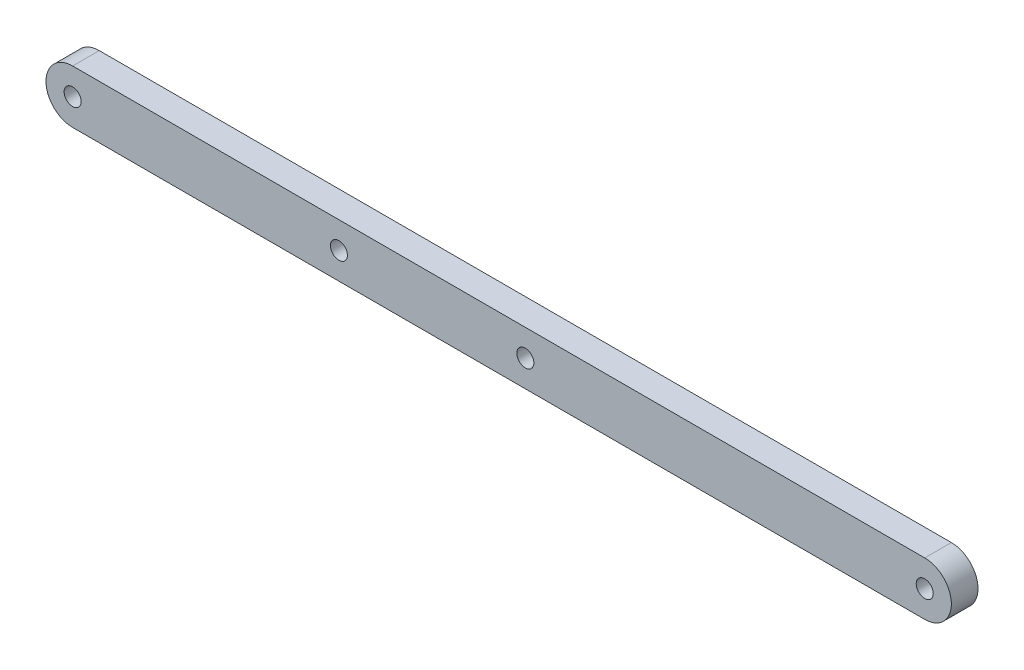
ISO-10303-21;
HEADER;
FILE_DESCRIPTION(('STEP AP214'),'2;1');
FILE_NAME('part.step','',(''),(''),'','','');
FILE_SCHEMA(('AUTOMOTIVE_DESIGN { 1 0 10303 214 1 1 1 1 }'));
ENDSEC;
DATA;
#1=APPLICATION_CONTEXT('core data for automotive mechanical design processes');
#2=APPLICATION_PROTOCOL_DEFINITION('international standard','automotive_design',2000,#1);
#3=PRODUCT_CONTEXT('',#1,'mechanical');
#4=PRODUCT('Part','Part','',(#3));
#5=PRODUCT_RELATED_PRODUCT_CATEGORY('part','',(#4));
#6=PRODUCT_DEFINITION_FORMATION('','',#4);
#7=PRODUCT_DEFINITION_CONTEXT('part definition',#1,'design');
#8=PRODUCT_DEFINITION('design','',#6,#7);
#9=PRODUCT_DEFINITION_SHAPE('','',#8);
#10=(LENGTH_UNIT() NAMED_UNIT(*) SI_UNIT(.MILLI.,.METRE.));
#11=(NAMED_UNIT(*) PLANE_ANGLE_UNIT() SI_UNIT($,.RADIAN.));
#12=(NAMED_UNIT(*) SI_UNIT($,.STERADIAN.) SOLID_ANGLE_UNIT());
#13=UNCERTAINTY_MEASURE_WITH_UNIT(LENGTH_MEASURE(1.E-05),#10,'distance_accuracy_value','');
#14=(GEOMETRIC_REPRESENTATION_CONTEXT(3) GLOBAL_UNCERTAINTY_ASSIGNED_CONTEXT((#13)) GLOBAL_UNIT_ASSIGNED_CONTEXT((#10,
#11,#12)) REPRESENTATION_CONTEXT('',''));
#15=CARTESIAN_POINT('',(0.,0.,0.));
#16=DIRECTION('',(0.,0.,1.));
#17=DIRECTION('',(1.,0.,0.));
#18=AXIS2_PLACEMENT_3D('',#15,#16,#17);
#19=CARTESIAN_POINT('',(0.,0.,-3.175));
#20=DIRECTION('',(0.,0.,-1.));
#21=DIRECTION('',(1.,0.,0.));
#22=AXIS2_PLACEMENT_3D('',#19,#20,#21);
#23=PLANE('',#22);
#24=CARTESIAN_POINT('',(63.5,0.,-3.175));
#25=DIRECTION('',(0.,0.,1.));
#26=DIRECTION('',(1.,0.,0.));
#27=AXIS2_PLACEMENT_3D('',#24,#25,#26);
#28=CIRCLE('',#27,2.03200000000001);
#29=CARTESIAN_POINT('',(65.532,0.,-3.175));
#30=VERTEX_POINT('',#29);
#31=EDGE_CURVE('E135',#30,#30,#28,.T.);
#32=ORIENTED_EDGE('',*,*,#31,.T.);
#33=EDGE_LOOP('',(#32));
#34=FACE_BOUND('',#33,.T.);
#35=CARTESIAN_POINT('',(0.,0.,-3.175));
#36=DIRECTION('',(0.,0.,1.));
#37=DIRECTION('',(1.,0.,0.));
#38=AXIS2_PLACEMENT_3D('',#35,#36,#37);
#39=CIRCLE('',#38,2.032);
#40=CARTESIAN_POINT('',(2.032,0.,-3.175));
#41=VERTEX_POINT('',#40);
#42=EDGE_CURVE('E136',#41,#41,#39,.T.);
#43=ORIENTED_EDGE('',*,*,#42,.T.);
#44=EDGE_LOOP('',(#43));
#45=FACE_BOUND('',#44,.T.);
#46=CARTESIAN_POINT('',(0.,0.,-3.175));
#47=DIRECTION('',(0.,0.,1.));
#48=DIRECTION('',(1.,0.,0.));
#49=AXIS2_PLACEMENT_3D('',#46,#47,#48);
#50=CIRCLE('',#49,6.35);
#51=CARTESIAN_POINT('',(0.,6.35,-3.175));
#52=VERTEX_POINT('',#51);
#53=CARTESIAN_POINT('',(0.,-6.35,-3.175));
#54=VERTEX_POINT('',#53);
#55=EDGE_CURVE('E107',#52,#54,#50,.T.);
#56=ORIENTED_EDGE('',*,*,#55,.F.);
#57=DIRECTION('',(-1.,0.,0.));
#58=VECTOR('',#57,1.);
#59=CARTESIAN_POINT('',(0.,6.35,-3.175));
#60=LINE('',#59,#58);
#61=CARTESIAN_POINT('',(203.2,6.35,-3.175));
#62=VERTEX_POINT('',#61);
#63=EDGE_CURVE('E110',#62,#52,#60,.T.);
#64=ORIENTED_EDGE('',*,*,#63,.F.);
#65=CARTESIAN_POINT('',(203.2,0.,-3.175));
#66=DIRECTION('',(0.,0.,1.));
#67=DIRECTION('',(1.,0.,0.));
#68=AXIS2_PLACEMENT_3D('',#65,#66,#67);
#69=CIRCLE('',#68,6.35);
#70=CARTESIAN_POINT('',(203.2,-6.35,-3.175));
#71=VERTEX_POINT('',#70);
#72=EDGE_CURVE('E97',#71,#62,#69,.T.);
#73=ORIENTED_EDGE('',*,*,#72,.F.);
#74=DIRECTION('',(1.,0.,0.));
#75=VECTOR('',#74,1.);
#76=CARTESIAN_POINT('',(0.,-6.35,-3.175));
#77=LINE('',#76,#75);
#78=EDGE_CURVE('E102',#54,#71,#77,.T.);
#79=ORIENTED_EDGE('',*,*,#78,.F.);
#80=EDGE_LOOP('',(#56,#64,#73,#79));
#81=FACE_BOUND('',#80,.T.);
#82=CARTESIAN_POINT('',(203.2,0.,-3.175));
#83=DIRECTION('',(0.,0.,1.));
#84=DIRECTION('',(1.,0.,0.));
#85=AXIS2_PLACEMENT_3D('',#82,#83,#84);
#86=CIRCLE('',#85,2.03200000000001);
#87=CARTESIAN_POINT('',(205.232,0.,-3.175));
#88=VERTEX_POINT('',#87);
#89=EDGE_CURVE('E124',#88,#88,#86,.T.);
#90=ORIENTED_EDGE('',*,*,#89,.T.);
#91=EDGE_LOOP('',(#90));
#92=FACE_BOUND('',#91,.T.);
#93=CARTESIAN_POINT('',(107.95,0.,-3.175));
#94=DIRECTION('',(0.,0.,1.));
#95=DIRECTION('',(1.,0.,0.));
#96=AXIS2_PLACEMENT_3D('',#93,#94,#95);
#97=CIRCLE('',#96,2.03200000000001);
#98=CARTESIAN_POINT('',(109.982,0.,-3.175));
#99=VERTEX_POINT('',#98);
#100=EDGE_CURVE('E253',#99,#99,#97,.T.);
#101=ORIENTED_EDGE('',*,*,#100,.T.);
#102=EDGE_LOOP('',(#101));
#103=FACE_BOUND('',#102,.T.);
#104=ADVANCED_FACE('F50',(#34,#45,#81,#92,#103),#23,.T.);
#105=CARTESIAN_POINT('',(0.,0.,3.175));
#106=DIRECTION('',(0.,0.,-1.));
#107=DIRECTION('',(1.,0.,0.));
#108=AXIS2_PLACEMENT_3D('',#105,#106,#107);
#109=PLANE('',#108);
#110=CARTESIAN_POINT('',(0.,0.,3.175));
#111=DIRECTION('',(0.,0.,1.));
#112=DIRECTION('',(1.,0.,0.));
#113=AXIS2_PLACEMENT_3D('',#110,#111,#112);
#114=CIRCLE('',#113,6.35);
#115=CARTESIAN_POINT('',(0.,6.35,3.175));
#116=VERTEX_POINT('',#115);
#117=CARTESIAN_POINT('',(0.,-6.35,3.175));
#118=VERTEX_POINT('',#117);
#119=EDGE_CURVE('E140',#116,#118,#114,.T.);
#120=ORIENTED_EDGE('',*,*,#119,.T.);
#121=DIRECTION('',(1.,0.,0.));
#122=VECTOR('',#121,1.);
#123=CARTESIAN_POINT('',(0.,-6.35,3.175));
#124=LINE('',#123,#122);
#125=CARTESIAN_POINT('',(203.2,-6.35,3.175));
#126=VERTEX_POINT('',#125);
#127=EDGE_CURVE('E150',#118,#126,#124,.T.);
#128=ORIENTED_EDGE('',*,*,#127,.T.);
#129=CARTESIAN_POINT('',(203.2,0.,3.175));
#130=DIRECTION('',(0.,0.,1.));
#131=DIRECTION('',(1.,0.,0.));
#132=AXIS2_PLACEMENT_3D('',#129,#130,#131);
#133=CIRCLE('',#132,6.35);
#134=CARTESIAN_POINT('',(203.2,6.35,3.175));
#135=VERTEX_POINT('',#134);
#136=EDGE_CURVE('E100',#126,#135,#133,.T.);
#137=ORIENTED_EDGE('',*,*,#136,.T.);
#138=DIRECTION('',(-1.,0.,0.));
#139=VECTOR('',#138,1.);
#140=CARTESIAN_POINT('',(0.,6.35,3.175));
#141=LINE('',#140,#139);
#142=EDGE_CURVE('E144',#135,#116,#141,.T.);
#143=ORIENTED_EDGE('',*,*,#142,.T.);
#144=EDGE_LOOP('',(#120,#128,#137,#143));
#145=FACE_BOUND('',#144,.T.);
#146=CARTESIAN_POINT('',(0.,0.,3.175));
#147=DIRECTION('',(0.,0.,1.));
#148=DIRECTION('',(1.,0.,0.));
#149=AXIS2_PLACEMENT_3D('',#146,#147,#148);
#150=CIRCLE('',#149,2.032);
#151=CARTESIAN_POINT('',(2.032,0.,3.175));
#152=VERTEX_POINT('',#151);
#153=EDGE_CURVE('E129',#152,#152,#150,.T.);
#154=ORIENTED_EDGE('',*,*,#153,.F.);
#155=EDGE_LOOP('',(#154));
#156=FACE_BOUND('',#155,.T.);
#157=CARTESIAN_POINT('',(203.2,0.,3.175));
#158=DIRECTION('',(0.,0.,1.));
#159=DIRECTION('',(1.,0.,0.));
#160=AXIS2_PLACEMENT_3D('',#157,#158,#159);
#161=CIRCLE('',#160,2.03200000000001);
#162=CARTESIAN_POINT('',(205.232,0.,3.175));
#163=VERTEX_POINT('',#162);
#164=EDGE_CURVE('E130',#163,#163,#161,.T.);
#165=ORIENTED_EDGE('',*,*,#164,.F.);
#166=EDGE_LOOP('',(#165));
#167=FACE_BOUND('',#166,.T.);
#168=CARTESIAN_POINT('',(63.5,0.,3.175));
#169=DIRECTION('',(0.,0.,1.));
#170=DIRECTION('',(1.,0.,0.));
#171=AXIS2_PLACEMENT_3D('',#168,#169,#170);
#172=CIRCLE('',#171,2.03200000000001);
#173=CARTESIAN_POINT('',(65.532,0.,3.175));
#174=VERTEX_POINT('',#173);
#175=EDGE_CURVE('E131',#174,#174,#172,.T.);
#176=ORIENTED_EDGE('',*,*,#175,.F.);
#177=EDGE_LOOP('',(#176));
#178=FACE_BOUND('',#177,.T.);
#179=CARTESIAN_POINT('',(107.95,0.,3.175));
#180=DIRECTION('',(0.,0.,1.));
#181=DIRECTION('',(1.,0.,0.));
#182=AXIS2_PLACEMENT_3D('',#179,#180,#181);
#183=CIRCLE('',#182,2.03200000000001);
#184=CARTESIAN_POINT('',(109.982,0.,3.175));
#185=VERTEX_POINT('',#184);
#186=EDGE_CURVE('E256',#185,#185,#183,.T.);
#187=ORIENTED_EDGE('',*,*,#186,.F.);
#188=EDGE_LOOP('',(#187));
#189=FACE_BOUND('',#188,.T.);
#190=ADVANCED_FACE('F156',(#145,#156,#167,#178,#189),#109,.F.);
#191=CARTESIAN_POINT('',(0.,0.,-3.175));
#192=DIRECTION('',(0.,0.,1.));
#193=DIRECTION('',(-1.,0.,0.));
#194=AXIS2_PLACEMENT_3D('',#191,#192,#193);
#195=CYLINDRICAL_SURFACE('',#194,6.35);
#196=ORIENTED_EDGE('',*,*,#119,.F.);
#197=DIRECTION('',(0.,0.,1.));
#198=VECTOR('',#197,1.);
#199=CARTESIAN_POINT('',(0.,6.35,-3.175));
#200=LINE('',#199,#198);
#201=EDGE_CURVE('E67',#52,#116,#200,.T.);
#202=ORIENTED_EDGE('',*,*,#201,.F.);
#203=ORIENTED_EDGE('',*,*,#55,.T.);
#204=DIRECTION('',(0.,0.,1.));
#205=VECTOR('',#204,1.);
#206=CARTESIAN_POINT('',(0.,-6.35,-3.175));
#207=LINE('',#206,#205);
#208=EDGE_CURVE('E12',#54,#118,#207,.T.);
#209=ORIENTED_EDGE('',*,*,#208,.T.);
#210=EDGE_LOOP('',(#196,#202,#203,#209));
#211=FACE_BOUND('',#210,.T.);
#212=ADVANCED_FACE('F52',(#211),#195,.T.);
#213=CARTESIAN_POINT('',(0.,-6.35,-3.175));
#214=DIRECTION('',(0.,1.,0.));
#215=DIRECTION('',(0.,0.,-1.));
#216=AXIS2_PLACEMENT_3D('',#213,#214,#215);
#217=PLANE('',#216);
#218=ORIENTED_EDGE('',*,*,#127,.F.);
#219=ORIENTED_EDGE('',*,*,#208,.F.);
#220=ORIENTED_EDGE('',*,*,#78,.T.);
#221=DIRECTION('',(0.,0.,1.));
#222=VECTOR('',#221,1.);
#223=CARTESIAN_POINT('',(203.2,-6.35,-3.175));
#224=LINE('',#223,#222);
#225=EDGE_CURVE('E59',#71,#126,#224,.T.);
#226=ORIENTED_EDGE('',*,*,#225,.T.);
#227=EDGE_LOOP('',(#218,#219,#220,#226));
#228=FACE_BOUND('',#227,.T.);
#229=ADVANCED_FACE('F103',(#228),#217,.F.);
#230=CARTESIAN_POINT('',(203.2,0.,-3.175));
#231=DIRECTION('',(0.,0.,1.));
#232=DIRECTION('',(-1.,0.,0.));
#233=AXIS2_PLACEMENT_3D('',#230,#231,#232);
#234=CYLINDRICAL_SURFACE('',#233,6.35);
#235=ORIENTED_EDGE('',*,*,#136,.F.);
#236=ORIENTED_EDGE('',*,*,#225,.F.);
#237=ORIENTED_EDGE('',*,*,#72,.T.);
#238=DIRECTION('',(0.,0.,1.));
#239=VECTOR('',#238,1.);
#240=CARTESIAN_POINT('',(203.2,6.35,-3.175));
#241=LINE('',#240,#239);
#242=EDGE_CURVE('E83',#62,#135,#241,.T.);
#243=ORIENTED_EDGE('',*,*,#242,.T.);
#244=EDGE_LOOP('',(#235,#236,#237,#243));
#245=FACE_BOUND('',#244,.T.);
#246=ADVANCED_FACE('F95',(#245),#234,.T.);
#247=CARTESIAN_POINT('',(0.,6.35,-3.175));
#248=DIRECTION('',(0.,-1.,0.));
#249=DIRECTION('',(0.,0.,1.));
#250=AXIS2_PLACEMENT_3D('',#247,#248,#249);
#251=PLANE('',#250);
#252=ORIENTED_EDGE('',*,*,#142,.F.);
#253=ORIENTED_EDGE('',*,*,#242,.F.);
#254=ORIENTED_EDGE('',*,*,#63,.T.);
#255=ORIENTED_EDGE('',*,*,#201,.T.);
#256=EDGE_LOOP('',(#252,#253,#254,#255));
#257=FACE_BOUND('',#256,.T.);
#258=ADVANCED_FACE('F175',(#257),#251,.F.);
#259=CARTESIAN_POINT('',(0.,0.,-3.175));
#260=DIRECTION('',(0.,0.,1.));
#261=DIRECTION('',(-1.,0.,0.));
#262=AXIS2_PLACEMENT_3D('',#259,#260,#261);
#263=CYLINDRICAL_SURFACE('',#262,2.032);
#264=ORIENTED_EDGE('',*,*,#42,.F.);
#265=EDGE_LOOP('',(#264));
#266=FACE_BOUND('',#265,.T.);
#267=ORIENTED_EDGE('',*,*,#153,.T.);
#268=EDGE_LOOP('',(#267));
#269=FACE_BOUND('',#268,.T.);
#270=ADVANCED_FACE('F172',(#266,#269),#263,.F.);
#271=CARTESIAN_POINT('',(203.2,0.,-3.175));
#272=DIRECTION('',(0.,0.,1.));
#273=DIRECTION('',(-1.,0.,0.));
#274=AXIS2_PLACEMENT_3D('',#271,#272,#273);
#275=CYLINDRICAL_SURFACE('',#274,2.03200000000001);
#276=ORIENTED_EDGE('',*,*,#89,.F.);
#277=EDGE_LOOP('',(#276));
#278=FACE_BOUND('',#277,.T.);
#279=ORIENTED_EDGE('',*,*,#164,.T.);
#280=EDGE_LOOP('',(#279));
#281=FACE_BOUND('',#280,.T.);
#282=ADVANCED_FACE('F195',(#278,#281),#275,.F.);
#283=CARTESIAN_POINT('',(63.5,0.,-3.175));
#284=DIRECTION('',(0.,0.,1.));
#285=DIRECTION('',(-1.,0.,0.));
#286=AXIS2_PLACEMENT_3D('',#283,#284,#285);
#287=CYLINDRICAL_SURFACE('',#286,2.03200000000001);
#288=ORIENTED_EDGE('',*,*,#31,.F.);
#289=EDGE_LOOP('',(#288));
#290=FACE_BOUND('',#289,.T.);
#291=ORIENTED_EDGE('',*,*,#175,.T.);
#292=EDGE_LOOP('',(#291));
#293=FACE_BOUND('',#292,.T.);
#294=ADVANCED_FACE('F203',(#290,#293),#287,.F.);
#295=CARTESIAN_POINT('',(107.95,0.,-3.175));
#296=DIRECTION('',(0.,0.,1.));
#297=DIRECTION('',(-1.,0.,0.));
#298=AXIS2_PLACEMENT_3D('',#295,#296,#297);
#299=CYLINDRICAL_SURFACE('',#298,2.03200000000001);
#300=ORIENTED_EDGE('',*,*,#100,.F.);
#301=EDGE_LOOP('',(#300));
#302=FACE_BOUND('',#301,.T.);
#303=ORIENTED_EDGE('',*,*,#186,.T.);
#304=EDGE_LOOP('',(#303));
#305=FACE_BOUND('',#304,.T.);
#306=ADVANCED_FACE('F211',(#302,#305),#299,.F.);
#307=CLOSED_SHELL('',(#104,#190,#212,#229,#246,#258,#270,#282,#294,#306));
#308=MANIFOLD_SOLID_BREP('B2',#307);
#309=ADVANCED_BREP_SHAPE_REPRESENTATION('',(#18,#308),#14);
#310=SHAPE_DEFINITION_REPRESENTATION(#9,#309);
ENDSEC;
END-ISO-10303-21;
